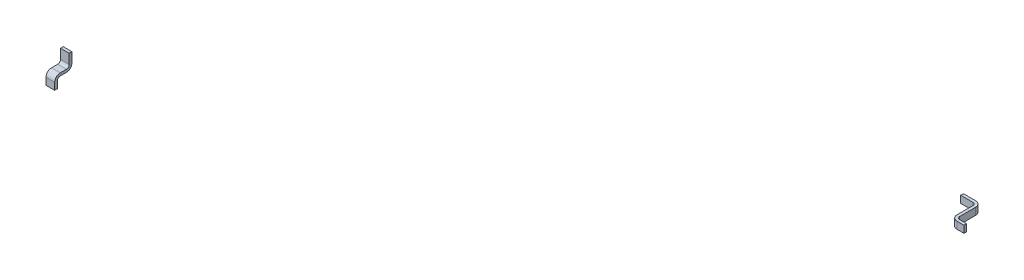
ISO-10303-21;
HEADER;
FILE_DESCRIPTION(('STEP AP214'),'2;1');
FILE_NAME('part.step','',(''),(''),'','','');
FILE_SCHEMA(('AUTOMOTIVE_DESIGN { 1 0 10303 214 1 1 1 1 }'));
ENDSEC;
DATA;
#1=APPLICATION_CONTEXT('core data for automotive mechanical design processes');
#2=APPLICATION_PROTOCOL_DEFINITION('international standard','automotive_design',2000,#1);
#3=PRODUCT_CONTEXT('',#1,'mechanical');
#4=PRODUCT('Part','Part','',(#3));
#5=PRODUCT_RELATED_PRODUCT_CATEGORY('part','',(#4));
#6=PRODUCT_DEFINITION_FORMATION('','',#4);
#7=PRODUCT_DEFINITION_CONTEXT('part definition',#1,'design');
#8=PRODUCT_DEFINITION('design','',#6,#7);
#9=PRODUCT_DEFINITION_SHAPE('','',#8);
#10=(LENGTH_UNIT() NAMED_UNIT(*) SI_UNIT(.MILLI.,.METRE.));
#11=(NAMED_UNIT(*) PLANE_ANGLE_UNIT() SI_UNIT($,.RADIAN.));
#12=(NAMED_UNIT(*) SI_UNIT($,.STERADIAN.) SOLID_ANGLE_UNIT());
#13=UNCERTAINTY_MEASURE_WITH_UNIT(LENGTH_MEASURE(1.E-05),#10,'distance_accuracy_value','');
#14=(GEOMETRIC_REPRESENTATION_CONTEXT(3) GLOBAL_UNCERTAINTY_ASSIGNED_CONTEXT((#13)) GLOBAL_UNIT_ASSIGNED_CONTEXT((#10,
#11,#12)) REPRESENTATION_CONTEXT('',''));
#15=CARTESIAN_POINT('',(0.,0.,0.));
#16=DIRECTION('',(0.,0.,1.));
#17=DIRECTION('',(1.,0.,0.));
#18=AXIS2_PLACEMENT_3D('',#15,#16,#17);
#19=CARTESIAN_POINT('',(-31.6795005463849,-0.229824884666565,2.05031594000001));
#20=DIRECTION('',(4.371138828674E-08,-1.,0.));
#21=DIRECTION('',(0.,0.,-1.));
#22=AXIS2_PLACEMENT_3D('',#19,#20,#21);
#23=PLANE('',#22);
#24=DIRECTION('',(1.,4.371138828674E-08,0.));
#25=VECTOR('',#24,1.);
#26=CARTESIAN_POINT('',(-31.6795005463849,-0.229824884666565,2.05031594000001));
#27=LINE('',#26,#25);
#28=CARTESIAN_POINT('',(-31.9945005463849,-0.229824898435662,2.05031594000001));
#29=VERTEX_POINT('',#28);
#30=CARTESIAN_POINT('',(-31.6795005463849,-0.229824884666565,2.05031594000001));
#31=VERTEX_POINT('',#30);
#32=EDGE_CURVE('P0_E193',#29,#31,#27,.T.);
#33=ORIENTED_EDGE('',*,*,#32,.F.);
#34=DIRECTION('',(0.,0.,-1.));
#35=VECTOR('',#34,1.);
#36=CARTESIAN_POINT('',(-31.9945005463849,-0.229824898435662,2.57531594000001));
#37=LINE('',#36,#35);
#38=CARTESIAN_POINT('',(-31.9945005463849,-0.229824898435662,2.15031594000001));
#39=VERTEX_POINT('',#38);
#40=EDGE_CURVE('P0_E11',#39,#29,#37,.T.);
#41=ORIENTED_EDGE('',*,*,#40,.F.);
#42=DIRECTION('',(-1.,-4.371138828674E-08,0.));
#43=VECTOR('',#42,1.);
#44=CARTESIAN_POINT('',(-31.9945005463849,-0.229824898435662,2.15031594000001));
#45=LINE('',#44,#43);
#46=CARTESIAN_POINT('',(-31.6795005463849,-0.229824884666565,2.15031594000001));
#47=VERTEX_POINT('',#46);
#48=EDGE_CURVE('P0_E122',#47,#39,#45,.T.);
#49=ORIENTED_EDGE('',*,*,#48,.F.);
#50=DIRECTION('',(0.,0.,1.));
#51=VECTOR('',#50,1.);
#52=CARTESIAN_POINT('',(-31.6795005463849,-0.229824884666565,2.67531594000001));
#53=LINE('',#52,#51);
#54=EDGE_CURVE('P0_E124',#31,#47,#53,.T.);
#55=ORIENTED_EDGE('',*,*,#54,.F.);
#56=EDGE_LOOP('',(#33,#41,#49,#55));
#57=FACE_BOUND('',#56,.T.);
#58=ADVANCED_FACE('P0_F17',(#57),#23,.F.);
#59=CARTESIAN_POINT('',(-31.9945005070447,-1.12982489843566,2.57531594000001));
#60=DIRECTION('',(1.,4.371138828674E-08,0.));
#61=DIRECTION('',(0.,0.,-1.));
#62=AXIS2_PLACEMENT_3D('',#59,#60,#61);
#63=PLANE('',#62);
#64=DIRECTION('',(-4.371138828674E-08,1.,0.));
#65=VECTOR('',#64,1.);
#66=CARTESIAN_POINT('',(-31.9945005070447,-1.12982489843566,2.67531594000001));
#67=LINE('',#66,#65);
#68=CARTESIAN_POINT('',(-31.9945005070447,-1.12982489843566,2.67531594000001));
#69=VERTEX_POINT('',#68);
#70=CARTESIAN_POINT('',(-31.9945005179725,-0.879824898435661,2.67531594000001));
#71=VERTEX_POINT('',#70);
#72=EDGE_CURVE('P0_E241',#69,#71,#67,.T.);
#73=ORIENTED_EDGE('',*,*,#72,.T.);
#74=CARTESIAN_POINT('',(-31.9945005179725,-0.879824898435661,2.47531594000001));
#75=DIRECTION('',(-1.,-4.371138828674E-08,0.));
#76=DIRECTION('',(0.,0.,-1.));
#77=AXIS2_PLACEMENT_3D('',#74,#75,#76);
#78=CIRCLE('',#77,0.2);
#79=CARTESIAN_POINT('',(-31.9945005267148,-0.679824898435655,2.47531594000001));
#80=VERTEX_POINT('',#79);
#81=EDGE_CURVE('P0_E174',#71,#80,#78,.T.);
#82=ORIENTED_EDGE('',*,*,#81,.T.);
#83=DIRECTION('',(0.,0.,-1.));
#84=VECTOR('',#83,1.);
#85=CARTESIAN_POINT('',(-31.9945005267148,-0.679824898435655,2.57531594000001));
#86=LINE('',#85,#84);
#87=CARTESIAN_POINT('',(-31.9945005267148,-0.679824898435655,2.25031594000001));
#88=VERTEX_POINT('',#87);
#89=EDGE_CURVE('P0_E169',#80,#88,#86,.T.);
#90=ORIENTED_EDGE('',*,*,#89,.T.);
#91=CARTESIAN_POINT('',(-31.9945005310859,-0.579824898435652,2.25031594000001));
#92=DIRECTION('',(1.,4.371138828674E-08,0.));
#93=DIRECTION('',(0.,0.,-1.));
#94=AXIS2_PLACEMENT_3D('',#91,#92,#93);
#95=CIRCLE('',#94,0.1);
#96=CARTESIAN_POINT('',(-31.9945005310859,-0.579824898435652,2.15031594000001));
#97=VERTEX_POINT('',#96);
#98=EDGE_CURVE('P0_E127',#88,#97,#95,.T.);
#99=ORIENTED_EDGE('',*,*,#98,.T.);
#100=DIRECTION('',(-4.371138828674E-08,1.,0.));
#101=VECTOR('',#100,1.);
#102=CARTESIAN_POINT('',(-31.9945005070447,-1.12982489843566,2.15031594000001));
#103=LINE('',#102,#101);
#104=EDGE_CURVE('P0_E28',#97,#39,#103,.T.);
#105=ORIENTED_EDGE('',*,*,#104,.T.);
#106=ORIENTED_EDGE('',*,*,#40,.T.);
#107=DIRECTION('',(-4.371138828674E-08,1.,0.));
#108=VECTOR('',#107,1.);
#109=CARTESIAN_POINT('',(-31.9945005310859,-0.579824898435652,2.05031594000001));
#110=LINE('',#109,#108);
#111=CARTESIAN_POINT('',(-31.9945005310859,-0.579824898435652,2.05031594000001));
#112=VERTEX_POINT('',#111);
#113=EDGE_CURVE('P0_E149',#112,#29,#110,.T.);
#114=ORIENTED_EDGE('',*,*,#113,.F.);
#115=CARTESIAN_POINT('',(-31.9945005310859,-0.579824898435652,2.25031594000001));
#116=DIRECTION('',(1.,4.371138828674E-08,0.));
#117=DIRECTION('',(0.,0.,-1.));
#118=AXIS2_PLACEMENT_3D('',#115,#116,#117);
#119=CIRCLE('',#118,0.2);
#120=CARTESIAN_POINT('',(-31.9945005223436,-0.779824898435658,2.25031594000001));
#121=VERTEX_POINT('',#120);
#122=EDGE_CURVE('P0_E159',#121,#112,#119,.T.);
#123=ORIENTED_EDGE('',*,*,#122,.F.);
#124=DIRECTION('',(0.,0.,-1.));
#125=VECTOR('',#124,1.);
#126=CARTESIAN_POINT('',(-31.9945005223436,-0.779824898435658,2.47531594000001));
#127=LINE('',#126,#125);
#128=CARTESIAN_POINT('',(-31.9945005223436,-0.779824898435658,2.47531594000001));
#129=VERTEX_POINT('',#128);
#130=EDGE_CURVE('P0_E164',#129,#121,#127,.T.);
#131=ORIENTED_EDGE('',*,*,#130,.F.);
#132=CARTESIAN_POINT('',(-31.9945005179725,-0.879824898435661,2.47531594000001));
#133=DIRECTION('',(-1.,-4.371138828674E-08,0.));
#134=DIRECTION('',(0.,0.,-1.));
#135=AXIS2_PLACEMENT_3D('',#132,#133,#134);
#136=CIRCLE('',#135,0.1);
#137=CARTESIAN_POINT('',(-31.9945005179725,-0.879824898435661,2.57531594000001));
#138=VERTEX_POINT('',#137);
#139=EDGE_CURVE('P0_E179',#138,#129,#136,.T.);
#140=ORIENTED_EDGE('',*,*,#139,.F.);
#141=DIRECTION('',(-4.371138828674E-08,1.,0.));
#142=VECTOR('',#141,1.);
#143=CARTESIAN_POINT('',(-31.9945005070447,-1.12982489843566,2.57531594000001));
#144=LINE('',#143,#142);
#145=CARTESIAN_POINT('',(-31.9945005070447,-1.12982489843566,2.57531594000001));
#146=VERTEX_POINT('',#145);
#147=EDGE_CURVE('P0_E223',#146,#138,#144,.T.);
#148=ORIENTED_EDGE('',*,*,#147,.F.);
#149=DIRECTION('',(0.,0.,-1.));
#150=VECTOR('',#149,1.);
#151=CARTESIAN_POINT('',(-31.9945005070447,-1.12982489843566,2.57531594000001));
#152=LINE('',#151,#150);
#153=EDGE_CURVE('P0_E230',#69,#146,#152,.T.);
#154=ORIENTED_EDGE('',*,*,#153,.F.);
#155=EDGE_LOOP('',(#73,#82,#90,#99,#105,#106,#114,#123,#131,#140,#148,#154));
#156=FACE_BOUND('',#155,.T.);
#157=ADVANCED_FACE('P0_F272',(#156),#63,.F.);
#158=CARTESIAN_POINT('',(-31.9945005310859,-0.579824898435652,2.15031594000001));
#159=DIRECTION('',(0.,0.,-1.));
#160=DIRECTION('',(-1.,-4.371138828674E-08,0.));
#161=AXIS2_PLACEMENT_3D('',#158,#159,#160);
#162=PLANE('',#161);
#163=ORIENTED_EDGE('',*,*,#48,.T.);
#164=ORIENTED_EDGE('',*,*,#104,.F.);
#165=DIRECTION('',(1.,4.371138828674E-08,0.));
#166=VECTOR('',#165,1.);
#167=CARTESIAN_POINT('',(-31.9945005310859,-0.579824898435652,2.15031594000001));
#168=LINE('',#167,#166);
#169=CARTESIAN_POINT('',(-31.679500531086,-0.579824884666569,2.15031594000001));
#170=VERTEX_POINT('',#169);
#171=EDGE_CURVE('P0_E118',#97,#170,#168,.T.);
#172=ORIENTED_EDGE('',*,*,#171,.T.);
#173=DIRECTION('',(-4.371138828674E-08,1.,0.));
#174=VECTOR('',#173,1.);
#175=CARTESIAN_POINT('',(-31.679500531086,-0.579824884666569,2.15031594000001));
#176=LINE('',#175,#174);
#177=EDGE_CURVE('P0_E129',#170,#47,#176,.T.);
#178=ORIENTED_EDGE('',*,*,#177,.T.);
#179=EDGE_LOOP('',(#163,#164,#172,#178));
#180=FACE_BOUND('',#179,.T.);
#181=ADVANCED_FACE('P0_F130',(#180),#162,.F.);
#182=CARTESIAN_POINT('',(-31.9945005310859,-0.579824898435652,2.25031594000001));
#183=DIRECTION('',(1.,4.371138828674E-08,0.));
#184=DIRECTION('',(0.,0.,-1.));
#185=AXIS2_PLACEMENT_3D('',#182,#183,#184);
#186=CYLINDRICAL_SURFACE('',#185,0.1);
#187=ORIENTED_EDGE('',*,*,#171,.F.);
#188=ORIENTED_EDGE('',*,*,#98,.F.);
#189=DIRECTION('',(-1.,-4.371138828674E-08,0.));
#190=VECTOR('',#189,1.);
#191=CARTESIAN_POINT('',(-31.9945005267148,-0.679824898435655,2.25031594000001));
#192=LINE('',#191,#190);
#193=CARTESIAN_POINT('',(-31.6795005267148,-0.679824884666572,2.25031594000001));
#194=VERTEX_POINT('',#193);
#195=EDGE_CURVE('P0_E173',#194,#88,#192,.T.);
#196=ORIENTED_EDGE('',*,*,#195,.F.);
#197=CARTESIAN_POINT('',(-31.679500531086,-0.579824884666569,2.25031594000001));
#198=DIRECTION('',(1.,4.371138828674E-08,0.));
#199=DIRECTION('',(0.,0.,1.));
#200=AXIS2_PLACEMENT_3D('',#197,#198,#199);
#201=CIRCLE('',#200,0.1);
#202=EDGE_CURVE('P0_E142',#194,#170,#201,.T.);
#203=ORIENTED_EDGE('',*,*,#202,.T.);
#204=EDGE_LOOP('',(#187,#188,#196,#203));
#205=FACE_BOUND('',#204,.T.);
#206=ADVANCED_FACE('P0_F274',(#205),#186,.F.);
#207=CARTESIAN_POINT('',(-31.9945005267148,-0.679824898435655,2.47531594000001));
#208=DIRECTION('',(4.371138828674E-08,-1.,0.));
#209=DIRECTION('',(-1.,-4.371138828674E-08,0.));
#210=AXIS2_PLACEMENT_3D('',#207,#208,#209);
#211=PLANE('',#210);
#212=ORIENTED_EDGE('',*,*,#195,.T.);
#213=ORIENTED_EDGE('',*,*,#89,.F.);
#214=DIRECTION('',(-1.,-4.371138828674E-08,0.));
#215=VECTOR('',#214,1.);
#216=CARTESIAN_POINT('',(-31.9945005267148,-0.679824898435655,2.47531594000001));
#217=LINE('',#216,#215);
#218=CARTESIAN_POINT('',(-31.6795005267148,-0.679824884666572,2.47531594000001));
#219=VERTEX_POINT('',#218);
#220=EDGE_CURVE('P0_E178',#219,#80,#217,.T.);
#221=ORIENTED_EDGE('',*,*,#220,.F.);
#222=DIRECTION('',(0.,0.,-1.));
#223=VECTOR('',#222,1.);
#224=CARTESIAN_POINT('',(-31.6795005267148,-0.679824884666572,2.47531594000001));
#225=LINE('',#224,#223);
#226=EDGE_CURVE('P0_E146',#219,#194,#225,.T.);
#227=ORIENTED_EDGE('',*,*,#226,.T.);
#228=EDGE_LOOP('',(#212,#213,#221,#227));
#229=FACE_BOUND('',#228,.T.);
#230=ADVANCED_FACE('P0_F278',(#229),#211,.F.);
#231=CARTESIAN_POINT('',(-31.9945005179725,-0.879824898435661,2.47531594000001));
#232=DIRECTION('',(-1.,-4.371138828674E-08,0.));
#233=DIRECTION('',(0.,0.,-1.));
#234=AXIS2_PLACEMENT_3D('',#231,#232,#233);
#235=CYLINDRICAL_SURFACE('',#234,0.2);
#236=CARTESIAN_POINT('',(-31.6795005179725,-0.879824884666564,2.47531594000001));
#237=DIRECTION('',(-1.,-4.371138828674E-08,0.));
#238=DIRECTION('',(0.,0.,1.));
#239=AXIS2_PLACEMENT_3D('',#236,#237,#238);
#240=CIRCLE('',#239,0.2);
#241=CARTESIAN_POINT('',(-31.6795005179725,-0.879824884666564,2.67531594000001));
#242=VERTEX_POINT('',#241);
#243=EDGE_CURVE('P0_E187',#242,#219,#240,.T.);
#244=ORIENTED_EDGE('',*,*,#243,.T.);
#245=ORIENTED_EDGE('',*,*,#220,.T.);
#246=ORIENTED_EDGE('',*,*,#81,.F.);
#247=DIRECTION('',(-1.,-4.371138828674E-08,0.));
#248=VECTOR('',#247,1.);
#249=CARTESIAN_POINT('',(-31.9945005179725,-0.879824898435661,2.67531594000001));
#250=LINE('',#249,#248);
#251=EDGE_CURVE('P0_E135',#242,#71,#250,.T.);
#252=ORIENTED_EDGE('',*,*,#251,.F.);
#253=EDGE_LOOP('',(#244,#245,#246,#252));
#254=FACE_BOUND('',#253,.T.);
#255=ADVANCED_FACE('P0_F280',(#254),#235,.T.);
#256=CARTESIAN_POINT('',(-31.9945005070447,-1.12982489843566,2.67531594000001));
#257=DIRECTION('',(0.,0.,-1.));
#258=DIRECTION('',(-1.,-4.371138828674E-08,0.));
#259=AXIS2_PLACEMENT_3D('',#256,#257,#258);
#260=PLANE('',#259);
#261=ORIENTED_EDGE('',*,*,#251,.T.);
#262=ORIENTED_EDGE('',*,*,#72,.F.);
#263=DIRECTION('',(-1.,-4.371138828674E-08,0.));
#264=VECTOR('',#263,1.);
#265=CARTESIAN_POINT('',(-31.9945005070447,-1.12982489843566,2.67531594000001));
#266=LINE('',#265,#264);
#267=CARTESIAN_POINT('',(-31.6795005070446,-1.12982488466656,2.67531594000001));
#268=VERTEX_POINT('',#267);
#269=EDGE_CURVE('P0_E217',#268,#69,#266,.T.);
#270=ORIENTED_EDGE('',*,*,#269,.F.);
#271=DIRECTION('',(-4.371138828674E-08,1.,0.));
#272=VECTOR('',#271,1.);
#273=CARTESIAN_POINT('',(-31.6795005070446,-1.12982488466656,2.67531594000001));
#274=LINE('',#273,#272);
#275=EDGE_CURVE('P0_E153',#268,#242,#274,.T.);
#276=ORIENTED_EDGE('',*,*,#275,.T.);
#277=EDGE_LOOP('',(#261,#262,#270,#276));
#278=FACE_BOUND('',#277,.T.);
#279=ADVANCED_FACE('P0_F286',(#278),#260,.F.);
#280=CARTESIAN_POINT('',(-31.6795005070446,-1.12982488466656,2.67531594000001));
#281=DIRECTION('',(-1.,-4.371138828674E-08,0.));
#282=DIRECTION('',(0.,0.,1.));
#283=AXIS2_PLACEMENT_3D('',#280,#281,#282);
#284=PLANE('',#283);
#285=DIRECTION('',(-4.371138828674E-08,1.,0.));
#286=VECTOR('',#285,1.);
#287=CARTESIAN_POINT('',(-31.6795005070446,-1.12982488466656,2.57531594000001));
#288=LINE('',#287,#286);
#289=CARTESIAN_POINT('',(-31.6795005070446,-1.12982488466656,2.57531594000001));
#290=VERTEX_POINT('',#289);
#291=CARTESIAN_POINT('',(-31.6795005179725,-0.879824884666564,2.57531594000001));
#292=VERTEX_POINT('',#291);
#293=EDGE_CURVE('P0_E220',#290,#292,#288,.T.);
#294=ORIENTED_EDGE('',*,*,#293,.T.);
#295=CARTESIAN_POINT('',(-31.6795005179725,-0.879824884666564,2.47531594000001));
#296=DIRECTION('',(-1.,-4.371138828674E-08,0.));
#297=DIRECTION('',(0.,0.,1.));
#298=AXIS2_PLACEMENT_3D('',#295,#296,#297);
#299=CIRCLE('',#298,0.1);
#300=CARTESIAN_POINT('',(-31.6795005223436,-0.779824884666575,2.47531594000001));
#301=VERTEX_POINT('',#300);
#302=EDGE_CURVE('P0_E21',#292,#301,#299,.T.);
#303=ORIENTED_EDGE('',*,*,#302,.T.);
#304=DIRECTION('',(0.,0.,-1.));
#305=VECTOR('',#304,1.);
#306=CARTESIAN_POINT('',(-31.6795005223436,-0.779824884666575,2.67531594000001));
#307=LINE('',#306,#305);
#308=CARTESIAN_POINT('',(-31.6795005223436,-0.779824884666575,2.25031594000001));
#309=VERTEX_POINT('',#308);
#310=EDGE_CURVE('P0_E168',#301,#309,#307,.T.);
#311=ORIENTED_EDGE('',*,*,#310,.T.);
#312=CARTESIAN_POINT('',(-31.679500531086,-0.579824884666569,2.25031594000001));
#313=DIRECTION('',(1.,4.371138828674E-08,0.));
#314=DIRECTION('',(0.,0.,1.));
#315=AXIS2_PLACEMENT_3D('',#312,#313,#314);
#316=CIRCLE('',#315,0.2);
#317=CARTESIAN_POINT('',(-31.679500531086,-0.579824884666569,2.05031594000001));
#318=VERTEX_POINT('',#317);
#319=EDGE_CURVE('P0_E194',#309,#318,#316,.T.);
#320=ORIENTED_EDGE('',*,*,#319,.T.);
#321=DIRECTION('',(-4.371138828674E-08,1.,0.));
#322=VECTOR('',#321,1.);
#323=CARTESIAN_POINT('',(-31.6795005070446,-1.12982488466656,2.05031594000001));
#324=LINE('',#323,#322);
#325=EDGE_CURVE('P0_E139',#318,#31,#324,.T.);
#326=ORIENTED_EDGE('',*,*,#325,.T.);
#327=ORIENTED_EDGE('',*,*,#54,.T.);
#328=ORIENTED_EDGE('',*,*,#177,.F.);
#329=ORIENTED_EDGE('',*,*,#202,.F.);
#330=ORIENTED_EDGE('',*,*,#226,.F.);
#331=ORIENTED_EDGE('',*,*,#243,.F.);
#332=ORIENTED_EDGE('',*,*,#275,.F.);
#333=DIRECTION('',(0.,0.,1.));
#334=VECTOR('',#333,1.);
#335=CARTESIAN_POINT('',(-31.6795005070446,-1.12982488466656,2.67531594000001));
#336=LINE('',#335,#334);
#337=EDGE_CURVE('P0_E213',#290,#268,#336,.T.);
#338=ORIENTED_EDGE('',*,*,#337,.F.);
#339=EDGE_LOOP('',(#294,#303,#311,#320,#326,#327,#328,#329,#330,#331,#332,#338));
#340=FACE_BOUND('',#339,.T.);
#341=ADVANCED_FACE('P0_F19',(#340),#284,.F.);
#342=CARTESIAN_POINT('',(-31.679500531086,-0.579824884666569,2.05031594000001));
#343=DIRECTION('',(0.,0.,1.));
#344=DIRECTION('',(1.,4.371138828674E-08,0.));
#345=AXIS2_PLACEMENT_3D('',#342,#343,#344);
#346=PLANE('',#345);
#347=ORIENTED_EDGE('',*,*,#32,.T.);
#348=ORIENTED_EDGE('',*,*,#325,.F.);
#349=DIRECTION('',(1.,4.371138828674E-08,0.));
#350=VECTOR('',#349,1.);
#351=CARTESIAN_POINT('',(-31.679500531086,-0.579824884666569,2.05031594000001));
#352=LINE('',#351,#350);
#353=EDGE_CURVE('P0_E163',#112,#318,#352,.T.);
#354=ORIENTED_EDGE('',*,*,#353,.F.);
#355=ORIENTED_EDGE('',*,*,#113,.T.);
#356=EDGE_LOOP('',(#347,#348,#354,#355));
#357=FACE_BOUND('',#356,.T.);
#358=ADVANCED_FACE('P0_F269',(#357),#346,.F.);
#359=CARTESIAN_POINT('',(-31.679500531086,-0.579824884666569,2.25031594000001));
#360=DIRECTION('',(1.,4.371138828674E-08,0.));
#361=DIRECTION('',(0.,0.,-1.));
#362=AXIS2_PLACEMENT_3D('',#359,#360,#361);
#363=CYLINDRICAL_SURFACE('',#362,0.2);
#364=ORIENTED_EDGE('',*,*,#122,.T.);
#365=ORIENTED_EDGE('',*,*,#353,.T.);
#366=ORIENTED_EDGE('',*,*,#319,.F.);
#367=DIRECTION('',(1.,4.371138828674E-08,0.));
#368=VECTOR('',#367,1.);
#369=CARTESIAN_POINT('',(-31.6795005223436,-0.779824884666575,2.25031594000001));
#370=LINE('',#369,#368);
#371=EDGE_CURVE('P0_E182',#121,#309,#370,.T.);
#372=ORIENTED_EDGE('',*,*,#371,.F.);
#373=EDGE_LOOP('',(#364,#365,#366,#372));
#374=FACE_BOUND('',#373,.T.);
#375=ADVANCED_FACE('P0_F329',(#374),#363,.T.);
#376=CARTESIAN_POINT('',(-31.6795005223436,-0.779824884666575,2.47531594000001));
#377=DIRECTION('',(-4.371138828674E-08,1.,0.));
#378=DIRECTION('',(1.,4.371138828674E-08,0.));
#379=AXIS2_PLACEMENT_3D('',#376,#377,#378);
#380=PLANE('',#379);
#381=ORIENTED_EDGE('',*,*,#371,.T.);
#382=ORIENTED_EDGE('',*,*,#310,.F.);
#383=DIRECTION('',(-1.,-4.371138828674E-08,0.));
#384=VECTOR('',#383,1.);
#385=CARTESIAN_POINT('',(-31.6795005223436,-0.779824884666575,2.47531594000001));
#386=LINE('',#385,#384);
#387=EDGE_CURVE('P0_E208',#301,#129,#386,.T.);
#388=ORIENTED_EDGE('',*,*,#387,.T.);
#389=ORIENTED_EDGE('',*,*,#130,.T.);
#390=EDGE_LOOP('',(#381,#382,#388,#389));
#391=FACE_BOUND('',#390,.T.);
#392=ADVANCED_FACE('P0_F327',(#391),#380,.F.);
#393=CARTESIAN_POINT('',(-31.6795005179725,-0.879824884666564,2.47531594000001));
#394=DIRECTION('',(-1.,-4.371138828674E-08,0.));
#395=DIRECTION('',(0.,0.,-1.));
#396=AXIS2_PLACEMENT_3D('',#393,#394,#395);
#397=CYLINDRICAL_SURFACE('',#396,0.1);
#398=ORIENTED_EDGE('',*,*,#387,.F.);
#399=ORIENTED_EDGE('',*,*,#302,.F.);
#400=DIRECTION('',(1.,4.371138828674E-08,0.));
#401=VECTOR('',#400,1.);
#402=CARTESIAN_POINT('',(-31.6795005179725,-0.879824884666564,2.57531594000001));
#403=LINE('',#402,#401);
#404=EDGE_CURVE('P0_E224',#138,#292,#403,.T.);
#405=ORIENTED_EDGE('',*,*,#404,.F.);
#406=ORIENTED_EDGE('',*,*,#139,.T.);
#407=EDGE_LOOP('',(#398,#399,#405,#406));
#408=FACE_BOUND('',#407,.T.);
#409=ADVANCED_FACE('P0_F321',(#408),#397,.F.);
#410=CARTESIAN_POINT('',(-31.6795005070446,-1.12982488466656,2.57531594000001));
#411=DIRECTION('',(0.,0.,1.));
#412=DIRECTION('',(1.,4.371138828674E-08,0.));
#413=AXIS2_PLACEMENT_3D('',#410,#411,#412);
#414=PLANE('',#413);
#415=ORIENTED_EDGE('',*,*,#404,.T.);
#416=ORIENTED_EDGE('',*,*,#293,.F.);
#417=DIRECTION('',(1.,4.371138828674E-08,0.));
#418=VECTOR('',#417,1.);
#419=CARTESIAN_POINT('',(-31.6795005070446,-1.12982488466656,2.57531594000001));
#420=LINE('',#419,#418);
#421=EDGE_CURVE('P0_E258',#146,#290,#420,.T.);
#422=ORIENTED_EDGE('',*,*,#421,.F.);
#423=ORIENTED_EDGE('',*,*,#147,.T.);
#424=EDGE_LOOP('',(#415,#416,#422,#423));
#425=FACE_BOUND('',#424,.T.);
#426=ADVANCED_FACE('P0_F311',(#425),#414,.F.);
#427=CARTESIAN_POINT('',(-31.6795005070446,-1.12982488466656,2.57531594000001));
#428=DIRECTION('',(4.371138828674E-08,-1.,0.));
#429=DIRECTION('',(0.,0.,-1.));
#430=AXIS2_PLACEMENT_3D('',#427,#428,#429);
#431=PLANE('',#430);
#432=ORIENTED_EDGE('',*,*,#337,.T.);
#433=ORIENTED_EDGE('',*,*,#269,.T.);
#434=ORIENTED_EDGE('',*,*,#153,.T.);
#435=ORIENTED_EDGE('',*,*,#421,.T.);
#436=EDGE_LOOP('',(#432,#433,#434,#435));
#437=FACE_BOUND('',#436,.T.);
#438=ADVANCED_FACE('P0_F293',(#437),#431,.T.);
#439=CLOSED_SHELL('',(#58,#157,#181,#206,#230,#255,#279,#341,#358,#375,#392,#409,#426,#438));
#440=MANIFOLD_SOLID_BREP('P0_B1',#439);
#441=CARTESIAN_POINT('',(0.599705188148059,11.4559646408175,2.05031594000001));
#442=DIRECTION('',(1.,0.,0.));
#443=DIRECTION('',(0.,0.,-1.));
#444=AXIS2_PLACEMENT_3D('',#441,#442,#443);
#445=PLANE('',#444);
#446=DIRECTION('',(0.,1.,0.));
#447=VECTOR('',#446,1.);
#448=CARTESIAN_POINT('',(0.599705188148059,11.4559646408175,2.05031594000001));
#449=LINE('',#448,#447);
#450=CARTESIAN_POINT('',(0.599705188148059,11.2009646408175,2.05031594000001));
#451=VERTEX_POINT('',#450);
#452=CARTESIAN_POINT('',(0.599705188148059,11.4559646408175,2.05031594000001));
#453=VERTEX_POINT('',#452);
#454=EDGE_CURVE('P1_E193',#451,#453,#449,.T.);
#455=ORIENTED_EDGE('',*,*,#454,.F.);
#456=DIRECTION('',(0.,0.,-1.));
#457=VECTOR('',#456,1.);
#458=CARTESIAN_POINT('',(0.599705188148059,11.2009646408175,2.93031594000001));
#459=LINE('',#458,#457);
#460=CARTESIAN_POINT('',(0.599705188148059,11.2009646408175,2.15031594000001));
#461=VERTEX_POINT('',#460);
#462=EDGE_CURVE('P1_E11',#461,#451,#459,.T.);
#463=ORIENTED_EDGE('',*,*,#462,.F.);
#464=DIRECTION('',(0.,-1.,0.));
#465=VECTOR('',#464,1.);
#466=CARTESIAN_POINT('',(0.599705188148059,11.2009646408175,2.15031594000001));
#467=LINE('',#466,#465);
#468=CARTESIAN_POINT('',(0.599705188148059,11.4559646408175,2.15031594000001));
#469=VERTEX_POINT('',#468);
#470=EDGE_CURVE('P1_E122',#469,#461,#467,.T.);
#471=ORIENTED_EDGE('',*,*,#470,.F.);
#472=DIRECTION('',(0.,0.,1.));
#473=VECTOR('',#472,1.);
#474=CARTESIAN_POINT('',(0.599705188148059,11.4559646408175,3.03031594000001));
#475=LINE('',#474,#473);
#476=EDGE_CURVE('P1_E124',#453,#469,#475,.T.);
#477=ORIENTED_EDGE('',*,*,#476,.F.);
#478=EDGE_LOOP('',(#455,#463,#471,#477));
#479=FACE_BOUND('',#478,.T.);
#480=ADVANCED_FACE('P1_F17',(#479),#445,.F.);
#481=CARTESIAN_POINT('',(1.59720518814807,11.2009646408175,2.93031594000001));
#482=DIRECTION('',(0.,1.,0.));
#483=DIRECTION('',(0.,0.,-1.));
#484=AXIS2_PLACEMENT_3D('',#481,#482,#483);
#485=PLANE('',#484);
#486=DIRECTION('',(-1.,0.,0.));
#487=VECTOR('',#486,1.);
#488=CARTESIAN_POINT('',(1.59720518814807,11.2009646408175,3.03031594000001));
#489=LINE('',#488,#487);
#490=CARTESIAN_POINT('',(1.59720518814807,11.2009646408175,3.03031594000001));
#491=VERTEX_POINT('',#490);
#492=CARTESIAN_POINT('',(1.34470518814808,11.2009646408175,3.03031594000001));
#493=VERTEX_POINT('',#492);
#494=EDGE_CURVE('P1_E241',#491,#493,#489,.T.);
#495=ORIENTED_EDGE('',*,*,#494,.T.);
#496=CARTESIAN_POINT('',(1.34470518814808,11.2009646408175,2.83031594000001));
#497=DIRECTION('',(0.,-1.,0.));
#498=DIRECTION('',(0.,0.,-1.));
#499=AXIS2_PLACEMENT_3D('',#496,#497,#498);
#500=CIRCLE('',#499,0.2);
#501=CARTESIAN_POINT('',(1.14470518814808,11.2009646408175,2.83031594000001));
#502=VERTEX_POINT('',#501);
#503=EDGE_CURVE('P1_E174',#493,#502,#500,.T.);
#504=ORIENTED_EDGE('',*,*,#503,.T.);
#505=DIRECTION('',(0.,0.,-1.));
#506=VECTOR('',#505,1.);
#507=CARTESIAN_POINT('',(1.14470518814808,11.2009646408175,2.93031594000001));
#508=LINE('',#507,#506);
#509=CARTESIAN_POINT('',(1.14470518814808,11.2009646408175,2.25031594000001));
#510=VERTEX_POINT('',#509);
#511=EDGE_CURVE('P1_E169',#502,#510,#508,.T.);
#512=ORIENTED_EDGE('',*,*,#511,.T.);
#513=CARTESIAN_POINT('',(1.04470518814806,11.2009646408175,2.25031594000001));
#514=DIRECTION('',(0.,1.,0.));
#515=DIRECTION('',(0.,0.,-1.));
#516=AXIS2_PLACEMENT_3D('',#513,#514,#515);
#517=CIRCLE('',#516,0.1);
#518=CARTESIAN_POINT('',(1.04470518814806,11.2009646408175,2.15031594000001));
#519=VERTEX_POINT('',#518);
#520=EDGE_CURVE('P1_E127',#510,#519,#517,.T.);
#521=ORIENTED_EDGE('',*,*,#520,.T.);
#522=DIRECTION('',(-1.,0.,0.));
#523=VECTOR('',#522,1.);
#524=CARTESIAN_POINT('',(1.59720518814807,11.2009646408175,2.15031594000001));
#525=LINE('',#524,#523);
#526=EDGE_CURVE('P1_E28',#519,#461,#525,.T.);
#527=ORIENTED_EDGE('',*,*,#526,.T.);
#528=ORIENTED_EDGE('',*,*,#462,.T.);
#529=DIRECTION('',(-1.,0.,0.));
#530=VECTOR('',#529,1.);
#531=CARTESIAN_POINT('',(1.04470518814806,11.2009646408175,2.05031594000001));
#532=LINE('',#531,#530);
#533=CARTESIAN_POINT('',(1.04470518814806,11.2009646408175,2.05031594000001));
#534=VERTEX_POINT('',#533);
#535=EDGE_CURVE('P1_E149',#534,#451,#532,.T.);
#536=ORIENTED_EDGE('',*,*,#535,.F.);
#537=CARTESIAN_POINT('',(1.04470518814806,11.2009646408175,2.25031594000001));
#538=DIRECTION('',(0.,1.,0.));
#539=DIRECTION('',(0.,0.,-1.));
#540=AXIS2_PLACEMENT_3D('',#537,#538,#539);
#541=CIRCLE('',#540,0.2);
#542=CARTESIAN_POINT('',(1.24470518814806,11.2009646408175,2.25031594000001));
#543=VERTEX_POINT('',#542);
#544=EDGE_CURVE('P1_E159',#543,#534,#541,.T.);
#545=ORIENTED_EDGE('',*,*,#544,.F.);
#546=DIRECTION('',(0.,0.,-1.));
#547=VECTOR('',#546,1.);
#548=CARTESIAN_POINT('',(1.24470518814806,11.2009646408175,2.83031594000001));
#549=LINE('',#548,#547);
#550=CARTESIAN_POINT('',(1.24470518814806,11.2009646408175,2.83031594000001));
#551=VERTEX_POINT('',#550);
#552=EDGE_CURVE('P1_E164',#551,#543,#549,.T.);
#553=ORIENTED_EDGE('',*,*,#552,.F.);
#554=CARTESIAN_POINT('',(1.34470518814808,11.2009646408175,2.83031594000001));
#555=DIRECTION('',(0.,-1.,0.));
#556=DIRECTION('',(0.,0.,-1.));
#557=AXIS2_PLACEMENT_3D('',#554,#555,#556);
#558=CIRCLE('',#557,0.1);
#559=CARTESIAN_POINT('',(1.34470518814808,11.2009646408175,2.93031594000001));
#560=VERTEX_POINT('',#559);
#561=EDGE_CURVE('P1_E179',#560,#551,#558,.T.);
#562=ORIENTED_EDGE('',*,*,#561,.F.);
#563=DIRECTION('',(-1.,0.,0.));
#564=VECTOR('',#563,1.);
#565=CARTESIAN_POINT('',(1.59720518814807,11.2009646408175,2.93031594000001));
#566=LINE('',#565,#564);
#567=CARTESIAN_POINT('',(1.59720518814807,11.2009646408175,2.93031594000001));
#568=VERTEX_POINT('',#567);
#569=EDGE_CURVE('P1_E223',#568,#560,#566,.T.);
#570=ORIENTED_EDGE('',*,*,#569,.F.);
#571=DIRECTION('',(0.,0.,-1.));
#572=VECTOR('',#571,1.);
#573=CARTESIAN_POINT('',(1.59720518814807,11.2009646408175,2.93031594000001));
#574=LINE('',#573,#572);
#575=EDGE_CURVE('P1_E230',#491,#568,#574,.T.);
#576=ORIENTED_EDGE('',*,*,#575,.F.);
#577=EDGE_LOOP('',(#495,#504,#512,#521,#527,#528,#536,#545,#553,#562,#570,#576));
#578=FACE_BOUND('',#577,.T.);
#579=ADVANCED_FACE('P1_F272',(#578),#485,.F.);
#580=CARTESIAN_POINT('',(1.04470518814806,11.2009646408175,2.15031594000001));
#581=DIRECTION('',(0.,0.,-1.));
#582=DIRECTION('',(0.,-1.,0.));
#583=AXIS2_PLACEMENT_3D('',#580,#581,#582);
#584=PLANE('',#583);
#585=ORIENTED_EDGE('',*,*,#470,.T.);
#586=ORIENTED_EDGE('',*,*,#526,.F.);
#587=DIRECTION('',(0.,1.,0.));
#588=VECTOR('',#587,1.);
#589=CARTESIAN_POINT('',(1.04470518814806,11.2009646408175,2.15031594000001));
#590=LINE('',#589,#588);
#591=CARTESIAN_POINT('',(1.04470518814806,11.4559646408175,2.15031594000001));
#592=VERTEX_POINT('',#591);
#593=EDGE_CURVE('P1_E118',#519,#592,#590,.T.);
#594=ORIENTED_EDGE('',*,*,#593,.T.);
#595=DIRECTION('',(-1.,0.,0.));
#596=VECTOR('',#595,1.);
#597=CARTESIAN_POINT('',(1.04470518814806,11.4559646408175,2.15031594000001));
#598=LINE('',#597,#596);
#599=EDGE_CURVE('P1_E129',#592,#469,#598,.T.);
#600=ORIENTED_EDGE('',*,*,#599,.T.);
#601=EDGE_LOOP('',(#585,#586,#594,#600));
#602=FACE_BOUND('',#601,.T.);
#603=ADVANCED_FACE('P1_F130',(#602),#584,.F.);
#604=CARTESIAN_POINT('',(1.04470518814806,11.2009646408175,2.25031594000001));
#605=DIRECTION('',(0.,1.,0.));
#606=DIRECTION('',(0.,0.,-1.));
#607=AXIS2_PLACEMENT_3D('',#604,#605,#606);
#608=CYLINDRICAL_SURFACE('',#607,0.1);
#609=ORIENTED_EDGE('',*,*,#593,.F.);
#610=ORIENTED_EDGE('',*,*,#520,.F.);
#611=DIRECTION('',(0.,-1.,0.));
#612=VECTOR('',#611,1.);
#613=CARTESIAN_POINT('',(1.14470518814808,11.2009646408175,2.25031594000001));
#614=LINE('',#613,#612);
#615=CARTESIAN_POINT('',(1.14470518814808,11.4559646408175,2.25031594000001));
#616=VERTEX_POINT('',#615);
#617=EDGE_CURVE('P1_E173',#616,#510,#614,.T.);
#618=ORIENTED_EDGE('',*,*,#617,.F.);
#619=CARTESIAN_POINT('',(1.04470518814806,11.4559646408175,2.25031594000001));
#620=DIRECTION('',(0.,1.,0.));
#621=DIRECTION('',(0.,0.,1.));
#622=AXIS2_PLACEMENT_3D('',#619,#620,#621);
#623=CIRCLE('',#622,0.1);
#624=EDGE_CURVE('P1_E142',#616,#592,#623,.T.);
#625=ORIENTED_EDGE('',*,*,#624,.T.);
#626=EDGE_LOOP('',(#609,#610,#618,#625));
#627=FACE_BOUND('',#626,.T.);
#628=ADVANCED_FACE('P1_F274',(#627),#608,.F.);
#629=CARTESIAN_POINT('',(1.14470518814808,11.2009646408175,2.83031594000001));
#630=DIRECTION('',(1.,0.,0.));
#631=DIRECTION('',(0.,-1.,0.));
#632=AXIS2_PLACEMENT_3D('',#629,#630,#631);
#633=PLANE('',#632);
#634=ORIENTED_EDGE('',*,*,#617,.T.);
#635=ORIENTED_EDGE('',*,*,#511,.F.);
#636=DIRECTION('',(0.,-1.,0.));
#637=VECTOR('',#636,1.);
#638=CARTESIAN_POINT('',(1.14470518814808,11.2009646408175,2.83031594000001));
#639=LINE('',#638,#637);
#640=CARTESIAN_POINT('',(1.14470518814808,11.4559646408175,2.83031594000001));
#641=VERTEX_POINT('',#640);
#642=EDGE_CURVE('P1_E178',#641,#502,#639,.T.);
#643=ORIENTED_EDGE('',*,*,#642,.F.);
#644=DIRECTION('',(0.,0.,-1.));
#645=VECTOR('',#644,1.);
#646=CARTESIAN_POINT('',(1.14470518814808,11.4559646408175,2.83031594000001));
#647=LINE('',#646,#645);
#648=EDGE_CURVE('P1_E146',#641,#616,#647,.T.);
#649=ORIENTED_EDGE('',*,*,#648,.T.);
#650=EDGE_LOOP('',(#634,#635,#643,#649));
#651=FACE_BOUND('',#650,.T.);
#652=ADVANCED_FACE('P1_F278',(#651),#633,.F.);
#653=CARTESIAN_POINT('',(1.34470518814808,11.2009646408175,2.83031594000001));
#654=DIRECTION('',(0.,-1.,0.));
#655=DIRECTION('',(0.,0.,-1.));
#656=AXIS2_PLACEMENT_3D('',#653,#654,#655);
#657=CYLINDRICAL_SURFACE('',#656,0.2);
#658=CARTESIAN_POINT('',(1.34470518814808,11.4559646408175,2.83031594000001));
#659=DIRECTION('',(0.,-1.,0.));
#660=DIRECTION('',(0.,0.,1.));
#661=AXIS2_PLACEMENT_3D('',#658,#659,#660);
#662=CIRCLE('',#661,0.2);
#663=CARTESIAN_POINT('',(1.34470518814808,11.4559646408175,3.03031594000001));
#664=VERTEX_POINT('',#663);
#665=EDGE_CURVE('P1_E187',#664,#641,#662,.T.);
#666=ORIENTED_EDGE('',*,*,#665,.T.);
#667=ORIENTED_EDGE('',*,*,#642,.T.);
#668=ORIENTED_EDGE('',*,*,#503,.F.);
#669=DIRECTION('',(0.,-1.,0.));
#670=VECTOR('',#669,1.);
#671=CARTESIAN_POINT('',(1.34470518814808,11.2009646408175,3.03031594000001));
#672=LINE('',#671,#670);
#673=EDGE_CURVE('P1_E135',#664,#493,#672,.T.);
#674=ORIENTED_EDGE('',*,*,#673,.F.);
#675=EDGE_LOOP('',(#666,#667,#668,#674));
#676=FACE_BOUND('',#675,.T.);
#677=ADVANCED_FACE('P1_F280',(#676),#657,.T.);
#678=CARTESIAN_POINT('',(1.59720518814807,11.2009646408175,3.03031594000001));
#679=DIRECTION('',(0.,0.,-1.));
#680=DIRECTION('',(0.,-1.,0.));
#681=AXIS2_PLACEMENT_3D('',#678,#679,#680);
#682=PLANE('',#681);
#683=ORIENTED_EDGE('',*,*,#673,.T.);
#684=ORIENTED_EDGE('',*,*,#494,.F.);
#685=DIRECTION('',(0.,-1.,0.));
#686=VECTOR('',#685,1.);
#687=CARTESIAN_POINT('',(1.59720518814807,11.2009646408175,3.03031594000001));
#688=LINE('',#687,#686);
#689=CARTESIAN_POINT('',(1.59720518814807,11.4559646408175,3.03031594000001));
#690=VERTEX_POINT('',#689);
#691=EDGE_CURVE('P1_E217',#690,#491,#688,.T.);
#692=ORIENTED_EDGE('',*,*,#691,.F.);
#693=DIRECTION('',(-1.,0.,0.));
#694=VECTOR('',#693,1.);
#695=CARTESIAN_POINT('',(1.59720518814807,11.4559646408175,3.03031594000001));
#696=LINE('',#695,#694);
#697=EDGE_CURVE('P1_E153',#690,#664,#696,.T.);
#698=ORIENTED_EDGE('',*,*,#697,.T.);
#699=EDGE_LOOP('',(#683,#684,#692,#698));
#700=FACE_BOUND('',#699,.T.);
#701=ADVANCED_FACE('P1_F286',(#700),#682,.F.);
#702=CARTESIAN_POINT('',(1.59720518814807,11.4559646408175,3.03031594000001));
#703=DIRECTION('',(0.,-1.,0.));
#704=DIRECTION('',(0.,0.,1.));
#705=AXIS2_PLACEMENT_3D('',#702,#703,#704);
#706=PLANE('',#705);
#707=DIRECTION('',(-1.,0.,0.));
#708=VECTOR('',#707,1.);
#709=CARTESIAN_POINT('',(1.59720518814807,11.4559646408175,2.93031594000001));
#710=LINE('',#709,#708);
#711=CARTESIAN_POINT('',(1.59720518814807,11.4559646408175,2.93031594000001));
#712=VERTEX_POINT('',#711);
#713=CARTESIAN_POINT('',(1.34470518814808,11.4559646408175,2.93031594000001));
#714=VERTEX_POINT('',#713);
#715=EDGE_CURVE('P1_E220',#712,#714,#710,.T.);
#716=ORIENTED_EDGE('',*,*,#715,.T.);
#717=CARTESIAN_POINT('',(1.34470518814808,11.4559646408175,2.83031594000001));
#718=DIRECTION('',(0.,-1.,0.));
#719=DIRECTION('',(0.,0.,1.));
#720=AXIS2_PLACEMENT_3D('',#717,#718,#719);
#721=CIRCLE('',#720,0.1);
#722=CARTESIAN_POINT('',(1.24470518814806,11.4559646408175,2.83031594000001));
#723=VERTEX_POINT('',#722);
#724=EDGE_CURVE('P1_E21',#714,#723,#721,.T.);
#725=ORIENTED_EDGE('',*,*,#724,.T.);
#726=DIRECTION('',(0.,0.,-1.));
#727=VECTOR('',#726,1.);
#728=CARTESIAN_POINT('',(1.24470518814806,11.4559646408175,3.03031594000001));
#729=LINE('',#728,#727);
#730=CARTESIAN_POINT('',(1.24470518814806,11.4559646408175,2.25031594000001));
#731=VERTEX_POINT('',#730);
#732=EDGE_CURVE('P1_E168',#723,#731,#729,.T.);
#733=ORIENTED_EDGE('',*,*,#732,.T.);
#734=CARTESIAN_POINT('',(1.04470518814806,11.4559646408175,2.25031594000001));
#735=DIRECTION('',(0.,1.,0.));
#736=DIRECTION('',(0.,0.,1.));
#737=AXIS2_PLACEMENT_3D('',#734,#735,#736);
#738=CIRCLE('',#737,0.2);
#739=CARTESIAN_POINT('',(1.04470518814806,11.4559646408175,2.05031594000001));
#740=VERTEX_POINT('',#739);
#741=EDGE_CURVE('P1_E194',#731,#740,#738,.T.);
#742=ORIENTED_EDGE('',*,*,#741,.T.);
#743=DIRECTION('',(-1.,0.,0.));
#744=VECTOR('',#743,1.);
#745=CARTESIAN_POINT('',(1.59720518814807,11.4559646408175,2.05031594000001));
#746=LINE('',#745,#744);
#747=EDGE_CURVE('P1_E139',#740,#453,#746,.T.);
#748=ORIENTED_EDGE('',*,*,#747,.T.);
#749=ORIENTED_EDGE('',*,*,#476,.T.);
#750=ORIENTED_EDGE('',*,*,#599,.F.);
#751=ORIENTED_EDGE('',*,*,#624,.F.);
#752=ORIENTED_EDGE('',*,*,#648,.F.);
#753=ORIENTED_EDGE('',*,*,#665,.F.);
#754=ORIENTED_EDGE('',*,*,#697,.F.);
#755=DIRECTION('',(0.,0.,1.));
#756=VECTOR('',#755,1.);
#757=CARTESIAN_POINT('',(1.59720518814807,11.4559646408175,3.03031594000001));
#758=LINE('',#757,#756);
#759=EDGE_CURVE('P1_E213',#712,#690,#758,.T.);
#760=ORIENTED_EDGE('',*,*,#759,.F.);
#761=EDGE_LOOP('',(#716,#725,#733,#742,#748,#749,#750,#751,#752,#753,#754,#760));
#762=FACE_BOUND('',#761,.T.);
#763=ADVANCED_FACE('P1_F19',(#762),#706,.F.);
#764=CARTESIAN_POINT('',(1.04470518814806,11.4559646408175,2.05031594000001));
#765=DIRECTION('',(0.,0.,1.));
#766=DIRECTION('',(0.,1.,0.));
#767=AXIS2_PLACEMENT_3D('',#764,#765,#766);
#768=PLANE('',#767);
#769=ORIENTED_EDGE('',*,*,#454,.T.);
#770=ORIENTED_EDGE('',*,*,#747,.F.);
#771=DIRECTION('',(0.,1.,0.));
#772=VECTOR('',#771,1.);
#773=CARTESIAN_POINT('',(1.04470518814806,11.4559646408175,2.05031594000001));
#774=LINE('',#773,#772);
#775=EDGE_CURVE('P1_E163',#534,#740,#774,.T.);
#776=ORIENTED_EDGE('',*,*,#775,.F.);
#777=ORIENTED_EDGE('',*,*,#535,.T.);
#778=EDGE_LOOP('',(#769,#770,#776,#777));
#779=FACE_BOUND('',#778,.T.);
#780=ADVANCED_FACE('P1_F269',(#779),#768,.F.);
#781=CARTESIAN_POINT('',(1.04470518814806,11.4559646408175,2.25031594000001));
#782=DIRECTION('',(0.,1.,0.));
#783=DIRECTION('',(0.,0.,-1.));
#784=AXIS2_PLACEMENT_3D('',#781,#782,#783);
#785=CYLINDRICAL_SURFACE('',#784,0.2);
#786=ORIENTED_EDGE('',*,*,#544,.T.);
#787=ORIENTED_EDGE('',*,*,#775,.T.);
#788=ORIENTED_EDGE('',*,*,#741,.F.);
#789=DIRECTION('',(0.,1.,0.));
#790=VECTOR('',#789,1.);
#791=CARTESIAN_POINT('',(1.24470518814806,11.4559646408175,2.25031594000001));
#792=LINE('',#791,#790);
#793=EDGE_CURVE('P1_E182',#543,#731,#792,.T.);
#794=ORIENTED_EDGE('',*,*,#793,.F.);
#795=EDGE_LOOP('',(#786,#787,#788,#794));
#796=FACE_BOUND('',#795,.T.);
#797=ADVANCED_FACE('P1_F329',(#796),#785,.T.);
#798=CARTESIAN_POINT('',(1.24470518814806,11.4559646408175,2.83031594000001));
#799=DIRECTION('',(-1.,0.,0.));
#800=DIRECTION('',(0.,1.,0.));
#801=AXIS2_PLACEMENT_3D('',#798,#799,#800);
#802=PLANE('',#801);
#803=ORIENTED_EDGE('',*,*,#793,.T.);
#804=ORIENTED_EDGE('',*,*,#732,.F.);
#805=DIRECTION('',(0.,-1.,0.));
#806=VECTOR('',#805,1.);
#807=CARTESIAN_POINT('',(1.24470518814806,11.4559646408175,2.83031594000001));
#808=LINE('',#807,#806);
#809=EDGE_CURVE('P1_E208',#723,#551,#808,.T.);
#810=ORIENTED_EDGE('',*,*,#809,.T.);
#811=ORIENTED_EDGE('',*,*,#552,.T.);
#812=EDGE_LOOP('',(#803,#804,#810,#811));
#813=FACE_BOUND('',#812,.T.);
#814=ADVANCED_FACE('P1_F327',(#813),#802,.F.);
#815=CARTESIAN_POINT('',(1.34470518814808,11.4559646408175,2.83031594000001));
#816=DIRECTION('',(0.,-1.,0.));
#817=DIRECTION('',(0.,0.,-1.));
#818=AXIS2_PLACEMENT_3D('',#815,#816,#817);
#819=CYLINDRICAL_SURFACE('',#818,0.1);
#820=ORIENTED_EDGE('',*,*,#809,.F.);
#821=ORIENTED_EDGE('',*,*,#724,.F.);
#822=DIRECTION('',(0.,1.,0.));
#823=VECTOR('',#822,1.);
#824=CARTESIAN_POINT('',(1.34470518814808,11.4559646408175,2.93031594000001));
#825=LINE('',#824,#823);
#826=EDGE_CURVE('P1_E224',#560,#714,#825,.T.);
#827=ORIENTED_EDGE('',*,*,#826,.F.);
#828=ORIENTED_EDGE('',*,*,#561,.T.);
#829=EDGE_LOOP('',(#820,#821,#827,#828));
#830=FACE_BOUND('',#829,.T.);
#831=ADVANCED_FACE('P1_F321',(#830),#819,.F.);
#832=CARTESIAN_POINT('',(1.59720518814807,11.4559646408175,2.93031594000001));
#833=DIRECTION('',(0.,0.,1.));
#834=DIRECTION('',(0.,1.,0.));
#835=AXIS2_PLACEMENT_3D('',#832,#833,#834);
#836=PLANE('',#835);
#837=ORIENTED_EDGE('',*,*,#826,.T.);
#838=ORIENTED_EDGE('',*,*,#715,.F.);
#839=DIRECTION('',(0.,1.,0.));
#840=VECTOR('',#839,1.);
#841=CARTESIAN_POINT('',(1.59720518814807,11.4559646408175,2.93031594000001));
#842=LINE('',#841,#840);
#843=EDGE_CURVE('P1_E258',#568,#712,#842,.T.);
#844=ORIENTED_EDGE('',*,*,#843,.F.);
#845=ORIENTED_EDGE('',*,*,#569,.T.);
#846=EDGE_LOOP('',(#837,#838,#844,#845));
#847=FACE_BOUND('',#846,.T.);
#848=ADVANCED_FACE('P1_F311',(#847),#836,.F.);
#849=CARTESIAN_POINT('',(1.59720518814807,11.4559646408175,2.93031594000001));
#850=DIRECTION('',(1.,0.,0.));
#851=DIRECTION('',(0.,0.,-1.));
#852=AXIS2_PLACEMENT_3D('',#849,#850,#851);
#853=PLANE('',#852);
#854=ORIENTED_EDGE('',*,*,#759,.T.);
#855=ORIENTED_EDGE('',*,*,#691,.T.);
#856=ORIENTED_EDGE('',*,*,#575,.T.);
#857=ORIENTED_EDGE('',*,*,#843,.T.);
#858=EDGE_LOOP('',(#854,#855,#856,#857));
#859=FACE_BOUND('',#858,.T.);
#860=ADVANCED_FACE('P1_F293',(#859),#853,.T.);
#861=CLOSED_SHELL('',(#480,#579,#603,#628,#652,#677,#701,#763,#780,#797,#814,#831,#848,#860));
#862=MANIFOLD_SOLID_BREP('P1_B1',#861);
#863=ADVANCED_BREP_SHAPE_REPRESENTATION('',(#18,#440,#862),#14);
#864=SHAPE_DEFINITION_REPRESENTATION(#9,#863);
ENDSEC;
END-ISO-10303-21;
